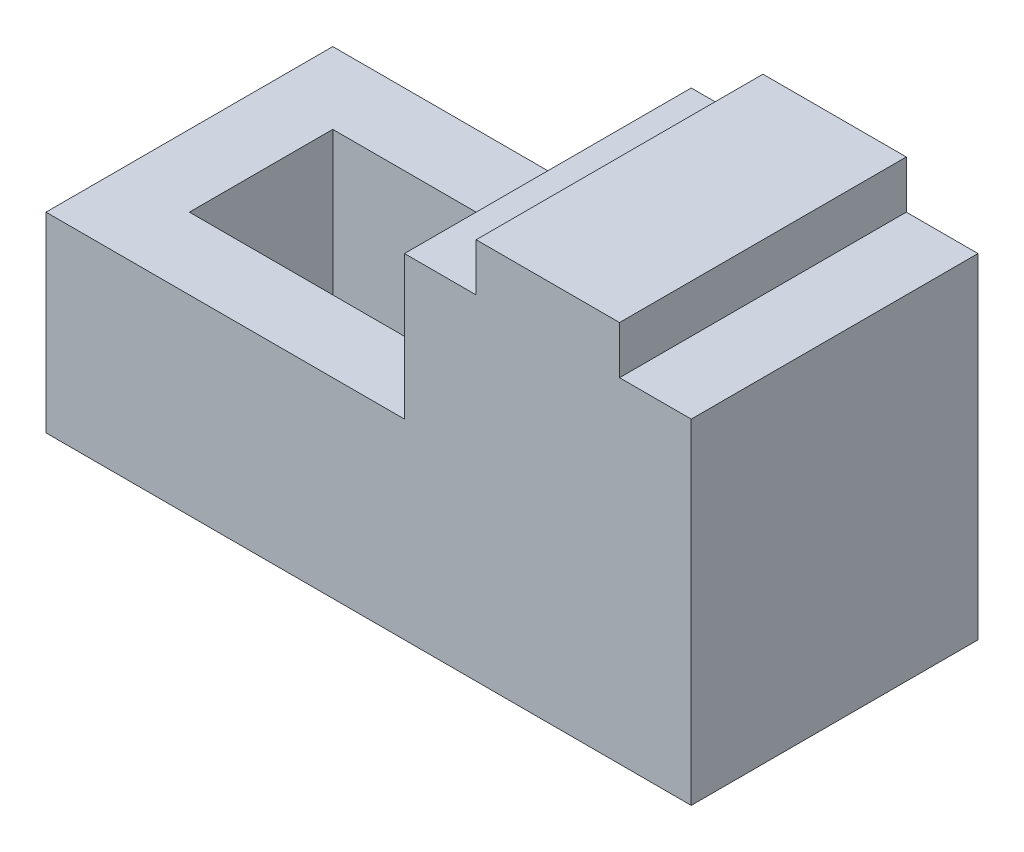
ISO-10303-21;
HEADER;
FILE_DESCRIPTION(('STEP AP214'),'2;1');
FILE_NAME('part.step','',(''),(''),'','','');
FILE_SCHEMA(('AUTOMOTIVE_DESIGN { 1 0 10303 214 1 1 1 1 }'));
ENDSEC;
DATA;
#1=APPLICATION_CONTEXT('core data for automotive mechanical design processes');
#2=APPLICATION_PROTOCOL_DEFINITION('international standard','automotive_design',2000,#1);
#3=PRODUCT_CONTEXT('',#1,'mechanical');
#4=PRODUCT('Part','Part','',(#3));
#5=PRODUCT_RELATED_PRODUCT_CATEGORY('part','',(#4));
#6=PRODUCT_DEFINITION_FORMATION('','',#4);
#7=PRODUCT_DEFINITION_CONTEXT('part definition',#1,'design');
#8=PRODUCT_DEFINITION('design','',#6,#7);
#9=PRODUCT_DEFINITION_SHAPE('','',#8);
#10=(LENGTH_UNIT() NAMED_UNIT(*) SI_UNIT(.MILLI.,.METRE.));
#11=(NAMED_UNIT(*) PLANE_ANGLE_UNIT() SI_UNIT($,.RADIAN.));
#12=(NAMED_UNIT(*) SI_UNIT($,.STERADIAN.) SOLID_ANGLE_UNIT());
#13=UNCERTAINTY_MEASURE_WITH_UNIT(LENGTH_MEASURE(1.E-05),#10,'distance_accuracy_value','');
#14=(GEOMETRIC_REPRESENTATION_CONTEXT(3) GLOBAL_UNCERTAINTY_ASSIGNED_CONTEXT((#13)) GLOBAL_UNIT_ASSIGNED_CONTEXT((#10,
#11,#12)) REPRESENTATION_CONTEXT('',''));
#15=CARTESIAN_POINT('',(0.,0.,0.));
#16=DIRECTION('',(0.,0.,1.));
#17=DIRECTION('',(1.,0.,0.));
#18=AXIS2_PLACEMENT_3D('',#15,#16,#17);
#19=CARTESIAN_POINT('',(60.,32.,48.));
#20=DIRECTION('',(0.,-1.,0.));
#21=DIRECTION('',(1.,0.,0.));
#22=AXIS2_PLACEMENT_3D('',#19,#20,#21);
#23=PLANE('',#22);
#24=DIRECTION('',(0.,0.,-1.));
#25=VECTOR('',#24,1.);
#26=CARTESIAN_POINT('',(60.,32.,48.));
#27=LINE('',#26,#25);
#28=CARTESIAN_POINT('',(60.,32.,48.));
#29=VERTEX_POINT('',#28);
#30=CARTESIAN_POINT('',(60.,32.,36.));
#31=VERTEX_POINT('',#30);
#32=EDGE_CURVE('E197',#29,#31,#27,.T.);
#33=ORIENTED_EDGE('',*,*,#32,.T.);
#34=DIRECTION('',(1.,0.,0.));
#35=VECTOR('',#34,1.);
#36=CARTESIAN_POINT('',(12.,32.,36.));
#37=LINE('',#36,#35);
#38=CARTESIAN_POINT('',(12.,32.,36.));
#39=VERTEX_POINT('',#38);
#40=EDGE_CURVE('E55',#39,#31,#37,.T.);
#41=ORIENTED_EDGE('',*,*,#40,.F.);
#42=DIRECTION('',(0.,0.,1.));
#43=VECTOR('',#42,1.);
#44=CARTESIAN_POINT('',(12.,32.,12.));
#45=LINE('',#44,#43);
#46=CARTESIAN_POINT('',(12.,32.,12.));
#47=VERTEX_POINT('',#46);
#48=EDGE_CURVE('E277',#47,#39,#45,.T.);
#49=ORIENTED_EDGE('',*,*,#48,.F.);
#50=DIRECTION('',(-1.,0.,0.));
#51=VECTOR('',#50,1.);
#52=CARTESIAN_POINT('',(60.,32.,12.));
#53=LINE('',#52,#51);
#54=CARTESIAN_POINT('',(60.,32.,12.));
#55=VERTEX_POINT('',#54);
#56=EDGE_CURVE('E281',#55,#47,#53,.T.);
#57=ORIENTED_EDGE('',*,*,#56,.F.);
#58=CARTESIAN_POINT('',(60.,32.,0.));
#59=VERTEX_POINT('',#58);
#60=EDGE_CURVE('E104',#55,#59,#27,.T.);
#61=ORIENTED_EDGE('',*,*,#60,.T.);
#62=DIRECTION('',(-1.,0.,0.));
#63=VECTOR('',#62,1.);
#64=CARTESIAN_POINT('',(60.,32.,0.));
#65=LINE('',#64,#63);
#66=CARTESIAN_POINT('',(0.,32.,0.));
#67=VERTEX_POINT('',#66);
#68=EDGE_CURVE('E166',#59,#67,#65,.T.);
#69=ORIENTED_EDGE('',*,*,#68,.T.);
#70=DIRECTION('',(0.,0.,-1.));
#71=VECTOR('',#70,1.);
#72=CARTESIAN_POINT('',(0.,32.,48.));
#73=LINE('',#72,#71);
#74=CARTESIAN_POINT('',(0.,32.,48.));
#75=VERTEX_POINT('',#74);
#76=EDGE_CURVE('E11',#75,#67,#73,.T.);
#77=ORIENTED_EDGE('',*,*,#76,.F.);
#78=DIRECTION('',(-1.,0.,0.));
#79=VECTOR('',#78,1.);
#80=CARTESIAN_POINT('',(60.,32.,48.));
#81=LINE('',#80,#79);
#82=EDGE_CURVE('E196',#29,#75,#81,.T.);
#83=ORIENTED_EDGE('',*,*,#82,.F.);
#84=EDGE_LOOP('',(#33,#41,#49,#57,#61,#69,#77,#83));
#85=FACE_BOUND('',#84,.T.);
#86=ADVANCED_FACE('F40',(#85),#23,.F.);
#87=CARTESIAN_POINT('',(0.,32.,48.));
#88=DIRECTION('',(1.,0.,0.));
#89=DIRECTION('',(0.,1.,0.));
#90=AXIS2_PLACEMENT_3D('',#87,#88,#89);
#91=PLANE('',#90);
#92=DIRECTION('',(0.,-1.,0.));
#93=VECTOR('',#92,1.);
#94=CARTESIAN_POINT('',(0.,32.,0.));
#95=LINE('',#94,#93);
#96=CARTESIAN_POINT('',(0.,0.,0.));
#97=VERTEX_POINT('',#96);
#98=EDGE_CURVE('E169',#67,#97,#95,.T.);
#99=ORIENTED_EDGE('',*,*,#98,.T.);
#100=DIRECTION('',(0.,0.,-1.));
#101=VECTOR('',#100,1.);
#102=CARTESIAN_POINT('',(0.,0.,48.));
#103=LINE('',#102,#101);
#104=CARTESIAN_POINT('',(0.,0.,48.));
#105=VERTEX_POINT('',#104);
#106=EDGE_CURVE('E48',#105,#97,#103,.T.);
#107=ORIENTED_EDGE('',*,*,#106,.F.);
#108=DIRECTION('',(0.,-1.,0.));
#109=VECTOR('',#108,1.);
#110=CARTESIAN_POINT('',(0.,32.,48.));
#111=LINE('',#110,#109);
#112=EDGE_CURVE('E112',#75,#105,#111,.T.);
#113=ORIENTED_EDGE('',*,*,#112,.F.);
#114=ORIENTED_EDGE('',*,*,#76,.T.);
#115=EDGE_LOOP('',(#99,#107,#113,#114));
#116=FACE_BOUND('',#115,.T.);
#117=ADVANCED_FACE('F326',(#116),#91,.F.);
#118=CARTESIAN_POINT('',(0.,0.,48.));
#119=DIRECTION('',(0.,1.,0.));
#120=DIRECTION('',(0.,0.,1.));
#121=AXIS2_PLACEMENT_3D('',#118,#119,#120);
#122=PLANE('',#121);
#123=DIRECTION('',(1.,0.,0.));
#124=VECTOR('',#123,1.);
#125=CARTESIAN_POINT('',(0.,0.,0.));
#126=LINE('',#125,#124);
#127=CARTESIAN_POINT('',(108.,0.,0.));
#128=VERTEX_POINT('',#127);
#129=EDGE_CURVE('E173',#97,#128,#126,.T.);
#130=ORIENTED_EDGE('',*,*,#129,.T.);
#131=DIRECTION('',(0.,0.,-1.));
#132=VECTOR('',#131,1.);
#133=CARTESIAN_POINT('',(108.,0.,48.));
#134=LINE('',#133,#132);
#135=CARTESIAN_POINT('',(108.,0.,48.));
#136=VERTEX_POINT('',#135);
#137=EDGE_CURVE('E217',#136,#128,#134,.T.);
#138=ORIENTED_EDGE('',*,*,#137,.F.);
#139=DIRECTION('',(1.,0.,0.));
#140=VECTOR('',#139,1.);
#141=CARTESIAN_POINT('',(0.,0.,48.));
#142=LINE('',#141,#140);
#143=EDGE_CURVE('E227',#105,#136,#142,.T.);
#144=ORIENTED_EDGE('',*,*,#143,.F.);
#145=ORIENTED_EDGE('',*,*,#106,.T.);
#146=EDGE_LOOP('',(#130,#138,#144,#145));
#147=FACE_BOUND('',#146,.T.);
#148=ADVANCED_FACE('F225',(#147),#122,.F.);
#149=CARTESIAN_POINT('',(108.,0.,48.));
#150=DIRECTION('',(-1.,0.,0.));
#151=DIRECTION('',(0.,0.,1.));
#152=AXIS2_PLACEMENT_3D('',#149,#150,#151);
#153=PLANE('',#152);
#154=DIRECTION('',(0.,1.,0.));
#155=VECTOR('',#154,1.);
#156=CARTESIAN_POINT('',(108.,0.,0.));
#157=LINE('',#156,#155);
#158=CARTESIAN_POINT('',(108.,56.,0.));
#159=VERTEX_POINT('',#158);
#160=EDGE_CURVE('E176',#128,#159,#157,.T.);
#161=ORIENTED_EDGE('',*,*,#160,.T.);
#162=DIRECTION('',(0.,0.,-1.));
#163=VECTOR('',#162,1.);
#164=CARTESIAN_POINT('',(108.,56.,48.));
#165=LINE('',#164,#163);
#166=CARTESIAN_POINT('',(108.,56.,48.));
#167=VERTEX_POINT('',#166);
#168=EDGE_CURVE('E213',#167,#159,#165,.T.);
#169=ORIENTED_EDGE('',*,*,#168,.F.);
#170=DIRECTION('',(0.,1.,0.));
#171=VECTOR('',#170,1.);
#172=CARTESIAN_POINT('',(108.,0.,48.));
#173=LINE('',#172,#171);
#174=EDGE_CURVE('E246',#136,#167,#173,.T.);
#175=ORIENTED_EDGE('',*,*,#174,.F.);
#176=ORIENTED_EDGE('',*,*,#137,.T.);
#177=EDGE_LOOP('',(#161,#169,#175,#176));
#178=FACE_BOUND('',#177,.T.);
#179=ADVANCED_FACE('F236',(#178),#153,.F.);
#180=CARTESIAN_POINT('',(108.,56.,48.));
#181=DIRECTION('',(0.,-1.,0.));
#182=DIRECTION('',(1.,0.,0.));
#183=AXIS2_PLACEMENT_3D('',#180,#181,#182);
#184=PLANE('',#183);
#185=DIRECTION('',(-1.,0.,0.));
#186=VECTOR('',#185,1.);
#187=CARTESIAN_POINT('',(108.,56.,0.));
#188=LINE('',#187,#186);
#189=CARTESIAN_POINT('',(96.,56.,0.));
#190=VERTEX_POINT('',#189);
#191=EDGE_CURVE('E179',#159,#190,#188,.T.);
#192=ORIENTED_EDGE('',*,*,#191,.T.);
#193=DIRECTION('',(0.,0.,-1.));
#194=VECTOR('',#193,1.);
#195=CARTESIAN_POINT('',(96.,56.,48.));
#196=LINE('',#195,#194);
#197=CARTESIAN_POINT('',(96.,56.,48.));
#198=VERTEX_POINT('',#197);
#199=EDGE_CURVE('E209',#198,#190,#196,.T.);
#200=ORIENTED_EDGE('',*,*,#199,.F.);
#201=DIRECTION('',(-1.,0.,0.));
#202=VECTOR('',#201,1.);
#203=CARTESIAN_POINT('',(108.,56.,48.));
#204=LINE('',#203,#202);
#205=EDGE_CURVE('E242',#167,#198,#204,.T.);
#206=ORIENTED_EDGE('',*,*,#205,.F.);
#207=ORIENTED_EDGE('',*,*,#168,.T.);
#208=EDGE_LOOP('',(#192,#200,#206,#207));
#209=FACE_BOUND('',#208,.T.);
#210=ADVANCED_FACE('F240',(#209),#184,.F.);
#211=CARTESIAN_POINT('',(96.,56.,48.));
#212=DIRECTION('',(-1.,0.,0.));
#213=DIRECTION('',(0.,0.,1.));
#214=AXIS2_PLACEMENT_3D('',#211,#212,#213);
#215=PLANE('',#214);
#216=DIRECTION('',(0.,1.,0.));
#217=VECTOR('',#216,1.);
#218=CARTESIAN_POINT('',(96.,56.,0.));
#219=LINE('',#218,#217);
#220=CARTESIAN_POINT('',(96.,64.,0.));
#221=VERTEX_POINT('',#220);
#222=EDGE_CURVE('E182',#190,#221,#219,.T.);
#223=ORIENTED_EDGE('',*,*,#222,.T.);
#224=DIRECTION('',(0.,0.,-1.));
#225=VECTOR('',#224,1.);
#226=CARTESIAN_POINT('',(96.,64.,48.));
#227=LINE('',#226,#225);
#228=CARTESIAN_POINT('',(96.,64.,48.));
#229=VERTEX_POINT('',#228);
#230=EDGE_CURVE('E205',#229,#221,#227,.T.);
#231=ORIENTED_EDGE('',*,*,#230,.F.);
#232=DIRECTION('',(0.,1.,0.));
#233=VECTOR('',#232,1.);
#234=CARTESIAN_POINT('',(96.,56.,48.));
#235=LINE('',#234,#233);
#236=EDGE_CURVE('E245',#198,#229,#235,.T.);
#237=ORIENTED_EDGE('',*,*,#236,.F.);
#238=ORIENTED_EDGE('',*,*,#199,.T.);
#239=EDGE_LOOP('',(#223,#231,#237,#238));
#240=FACE_BOUND('',#239,.T.);
#241=ADVANCED_FACE('F338',(#240),#215,.F.);
#242=CARTESIAN_POINT('',(96.,64.,48.));
#243=DIRECTION('',(0.,-1.,0.));
#244=DIRECTION('',(0.,0.,-1.));
#245=AXIS2_PLACEMENT_3D('',#242,#243,#244);
#246=PLANE('',#245);
#247=DIRECTION('',(-1.,0.,0.));
#248=VECTOR('',#247,1.);
#249=CARTESIAN_POINT('',(96.,64.,0.));
#250=LINE('',#249,#248);
#251=CARTESIAN_POINT('',(72.,64.,0.));
#252=VERTEX_POINT('',#251);
#253=EDGE_CURVE('E185',#221,#252,#250,.T.);
#254=ORIENTED_EDGE('',*,*,#253,.T.);
#255=DIRECTION('',(0.,0.,-1.));
#256=VECTOR('',#255,1.);
#257=CARTESIAN_POINT('',(72.,64.,48.));
#258=LINE('',#257,#256);
#259=CARTESIAN_POINT('',(72.,64.,48.));
#260=VERTEX_POINT('',#259);
#261=EDGE_CURVE('E155',#260,#252,#258,.T.);
#262=ORIENTED_EDGE('',*,*,#261,.F.);
#263=DIRECTION('',(-1.,0.,0.));
#264=VECTOR('',#263,1.);
#265=CARTESIAN_POINT('',(96.,64.,48.));
#266=LINE('',#265,#264);
#267=EDGE_CURVE('E141',#229,#260,#266,.T.);
#268=ORIENTED_EDGE('',*,*,#267,.F.);
#269=ORIENTED_EDGE('',*,*,#230,.T.);
#270=EDGE_LOOP('',(#254,#262,#268,#269));
#271=FACE_BOUND('',#270,.T.);
#272=ADVANCED_FACE('F341',(#271),#246,.F.);
#273=CARTESIAN_POINT('',(72.,64.,48.));
#274=DIRECTION('',(1.,0.,0.));
#275=DIRECTION('',(0.,1.,0.));
#276=AXIS2_PLACEMENT_3D('',#273,#274,#275);
#277=PLANE('',#276);
#278=DIRECTION('',(0.,-1.,0.));
#279=VECTOR('',#278,1.);
#280=CARTESIAN_POINT('',(72.,64.,0.));
#281=LINE('',#280,#279);
#282=CARTESIAN_POINT('',(72.,56.,0.));
#283=VERTEX_POINT('',#282);
#284=EDGE_CURVE('E151',#252,#283,#281,.T.);
#285=ORIENTED_EDGE('',*,*,#284,.T.);
#286=DIRECTION('',(0.,0.,-1.));
#287=VECTOR('',#286,1.);
#288=CARTESIAN_POINT('',(72.,56.,48.));
#289=LINE('',#288,#287);
#290=CARTESIAN_POINT('',(72.,56.,48.));
#291=VERTEX_POINT('',#290);
#292=EDGE_CURVE('E148',#291,#283,#289,.T.);
#293=ORIENTED_EDGE('',*,*,#292,.F.);
#294=DIRECTION('',(0.,-1.,0.));
#295=VECTOR('',#294,1.);
#296=CARTESIAN_POINT('',(72.,64.,48.));
#297=LINE('',#296,#295);
#298=EDGE_CURVE('E134',#260,#291,#297,.T.);
#299=ORIENTED_EDGE('',*,*,#298,.F.);
#300=ORIENTED_EDGE('',*,*,#261,.T.);
#301=EDGE_LOOP('',(#285,#293,#299,#300));
#302=FACE_BOUND('',#301,.T.);
#303=ADVANCED_FACE('F149',(#302),#277,.F.);
#304=CARTESIAN_POINT('',(72.,56.,48.));
#305=DIRECTION('',(0.,-1.,0.));
#306=DIRECTION('',(1.,0.,0.));
#307=AXIS2_PLACEMENT_3D('',#304,#305,#306);
#308=PLANE('',#307);
#309=DIRECTION('',(-1.,0.,0.));
#310=VECTOR('',#309,1.);
#311=CARTESIAN_POINT('',(72.,56.,0.));
#312=LINE('',#311,#310);
#313=CARTESIAN_POINT('',(60.,56.,0.));
#314=VERTEX_POINT('',#313);
#315=EDGE_CURVE('E190',#283,#314,#312,.T.);
#316=ORIENTED_EDGE('',*,*,#315,.T.);
#317=DIRECTION('',(0.,0.,-1.));
#318=VECTOR('',#317,1.);
#319=CARTESIAN_POINT('',(60.,56.,48.));
#320=LINE('',#319,#318);
#321=CARTESIAN_POINT('',(60.,56.,48.));
#322=VERTEX_POINT('',#321);
#323=EDGE_CURVE('E156',#322,#314,#320,.T.);
#324=ORIENTED_EDGE('',*,*,#323,.F.);
#325=DIRECTION('',(-1.,0.,0.));
#326=VECTOR('',#325,1.);
#327=CARTESIAN_POINT('',(72.,56.,48.));
#328=LINE('',#327,#326);
#329=EDGE_CURVE('E138',#291,#322,#328,.T.);
#330=ORIENTED_EDGE('',*,*,#329,.F.);
#331=ORIENTED_EDGE('',*,*,#292,.T.);
#332=EDGE_LOOP('',(#316,#324,#330,#331));
#333=FACE_BOUND('',#332,.T.);
#334=ADVANCED_FACE('F158',(#333),#308,.F.);
#335=CARTESIAN_POINT('',(60.,56.,48.));
#336=DIRECTION('',(1.,0.,0.));
#337=DIRECTION('',(0.,0.,-1.));
#338=AXIS2_PLACEMENT_3D('',#335,#336,#337);
#339=PLANE('',#338);
#340=DIRECTION('',(0.,-1.,0.));
#341=VECTOR('',#340,1.);
#342=CARTESIAN_POINT('',(60.,56.,0.));
#343=LINE('',#342,#341);
#344=EDGE_CURVE('E193',#314,#59,#343,.T.);
#345=ORIENTED_EDGE('',*,*,#344,.T.);
#346=ORIENTED_EDGE('',*,*,#60,.F.);
#347=DIRECTION('',(0.,1.,0.));
#348=VECTOR('',#347,1.);
#349=CARTESIAN_POINT('',(60.,8.00000000000001,12.));
#350=LINE('',#349,#348);
#351=CARTESIAN_POINT('',(60.,8.00000000000001,12.));
#352=VERTEX_POINT('',#351);
#353=EDGE_CURVE('E260',#352,#55,#350,.T.);
#354=ORIENTED_EDGE('',*,*,#353,.F.);
#355=DIRECTION('',(0.,0.,-1.));
#356=VECTOR('',#355,1.);
#357=CARTESIAN_POINT('',(60.,8.00000000000001,36.));
#358=LINE('',#357,#356);
#359=CARTESIAN_POINT('',(60.,8.00000000000001,36.));
#360=VERTEX_POINT('',#359);
#361=EDGE_CURVE('E276',#360,#352,#358,.T.);
#362=ORIENTED_EDGE('',*,*,#361,.F.);
#363=DIRECTION('',(0.,1.,0.));
#364=VECTOR('',#363,1.);
#365=CARTESIAN_POINT('',(60.,8.00000000000001,36.));
#366=LINE('',#365,#364);
#367=EDGE_CURVE('E170',#360,#31,#366,.T.);
#368=ORIENTED_EDGE('',*,*,#367,.T.);
#369=ORIENTED_EDGE('',*,*,#32,.F.);
#370=DIRECTION('',(0.,-1.,0.));
#371=VECTOR('',#370,1.);
#372=CARTESIAN_POINT('',(60.,56.,48.));
#373=LINE('',#372,#371);
#374=EDGE_CURVE('E64',#322,#29,#373,.T.);
#375=ORIENTED_EDGE('',*,*,#374,.F.);
#376=ORIENTED_EDGE('',*,*,#323,.T.);
#377=EDGE_LOOP('',(#345,#346,#354,#362,#368,#369,#375,#376));
#378=FACE_BOUND('',#377,.T.);
#379=ADVANCED_FACE('F308',(#378),#339,.F.);
#380=CARTESIAN_POINT('',(0.,0.,48.));
#381=DIRECTION('',(0.,0.,1.));
#382=DIRECTION('',(1.,0.,0.));
#383=AXIS2_PLACEMENT_3D('',#380,#381,#382);
#384=PLANE('',#383);
#385=ORIENTED_EDGE('',*,*,#82,.T.);
#386=ORIENTED_EDGE('',*,*,#112,.T.);
#387=ORIENTED_EDGE('',*,*,#143,.T.);
#388=ORIENTED_EDGE('',*,*,#174,.T.);
#389=ORIENTED_EDGE('',*,*,#205,.T.);
#390=ORIENTED_EDGE('',*,*,#236,.T.);
#391=ORIENTED_EDGE('',*,*,#267,.T.);
#392=ORIENTED_EDGE('',*,*,#298,.T.);
#393=ORIENTED_EDGE('',*,*,#329,.T.);
#394=ORIENTED_EDGE('',*,*,#374,.T.);
#395=EDGE_LOOP('',(#385,#386,#387,#388,#389,#390,#391,#392,#393,#394));
#396=FACE_BOUND('',#395,.T.);
#397=ADVANCED_FACE('F136',(#396),#384,.T.);
#398=CARTESIAN_POINT('',(0.,0.,0.));
#399=DIRECTION('',(0.,0.,1.));
#400=DIRECTION('',(1.,0.,0.));
#401=AXIS2_PLACEMENT_3D('',#398,#399,#400);
#402=PLANE('',#401);
#403=ORIENTED_EDGE('',*,*,#68,.F.);
#404=ORIENTED_EDGE('',*,*,#344,.F.);
#405=ORIENTED_EDGE('',*,*,#315,.F.);
#406=ORIENTED_EDGE('',*,*,#284,.F.);
#407=ORIENTED_EDGE('',*,*,#253,.F.);
#408=ORIENTED_EDGE('',*,*,#222,.F.);
#409=ORIENTED_EDGE('',*,*,#191,.F.);
#410=ORIENTED_EDGE('',*,*,#160,.F.);
#411=ORIENTED_EDGE('',*,*,#129,.F.);
#412=ORIENTED_EDGE('',*,*,#98,.F.);
#413=EDGE_LOOP('',(#403,#404,#405,#406,#407,#408,#409,#410,#411,#412));
#414=FACE_BOUND('',#413,.T.);
#415=ADVANCED_FACE('F231',(#414),#402,.F.);
#416=CARTESIAN_POINT('',(12.,8.,36.));
#417=DIRECTION('',(0.,0.,1.));
#418=DIRECTION('',(1.,0.,0.));
#419=AXIS2_PLACEMENT_3D('',#416,#417,#418);
#420=PLANE('',#419);
#421=ORIENTED_EDGE('',*,*,#40,.T.);
#422=ORIENTED_EDGE('',*,*,#367,.F.);
#423=DIRECTION('',(1.,0.,0.));
#424=VECTOR('',#423,1.);
#425=CARTESIAN_POINT('',(12.,8.,36.));
#426=LINE('',#425,#424);
#427=CARTESIAN_POINT('',(12.,8.,36.));
#428=VERTEX_POINT('',#427);
#429=EDGE_CURVE('E265',#428,#360,#426,.T.);
#430=ORIENTED_EDGE('',*,*,#429,.F.);
#431=DIRECTION('',(0.,1.,0.));
#432=VECTOR('',#431,1.);
#433=CARTESIAN_POINT('',(12.,8.,36.));
#434=LINE('',#433,#432);
#435=EDGE_CURVE('E269',#428,#39,#434,.T.);
#436=ORIENTED_EDGE('',*,*,#435,.T.);
#437=EDGE_LOOP('',(#421,#422,#430,#436));
#438=FACE_BOUND('',#437,.T.);
#439=ADVANCED_FACE('F320',(#438),#420,.F.);
#440=CARTESIAN_POINT('',(12.,8.,12.));
#441=DIRECTION('',(-1.,0.,0.));
#442=DIRECTION('',(0.,-1.,0.));
#443=AXIS2_PLACEMENT_3D('',#440,#441,#442);
#444=PLANE('',#443);
#445=ORIENTED_EDGE('',*,*,#48,.T.);
#446=ORIENTED_EDGE('',*,*,#435,.F.);
#447=DIRECTION('',(0.,0.,1.));
#448=VECTOR('',#447,1.);
#449=CARTESIAN_POINT('',(12.,8.,12.));
#450=LINE('',#449,#448);
#451=CARTESIAN_POINT('',(12.,8.,12.));
#452=VERTEX_POINT('',#451);
#453=EDGE_CURVE('E288',#452,#428,#450,.T.);
#454=ORIENTED_EDGE('',*,*,#453,.F.);
#455=DIRECTION('',(0.,1.,0.));
#456=VECTOR('',#455,1.);
#457=CARTESIAN_POINT('',(12.,8.,12.));
#458=LINE('',#457,#456);
#459=EDGE_CURVE('E264',#452,#47,#458,.T.);
#460=ORIENTED_EDGE('',*,*,#459,.T.);
#461=EDGE_LOOP('',(#445,#446,#454,#460));
#462=FACE_BOUND('',#461,.T.);
#463=ADVANCED_FACE('F322',(#462),#444,.F.);
#464=CARTESIAN_POINT('',(60.,8.00000000000001,12.));
#465=DIRECTION('',(0.,0.,-1.));
#466=DIRECTION('',(-1.,0.,0.));
#467=AXIS2_PLACEMENT_3D('',#464,#465,#466);
#468=PLANE('',#467);
#469=ORIENTED_EDGE('',*,*,#56,.T.);
#470=ORIENTED_EDGE('',*,*,#459,.F.);
#471=DIRECTION('',(-1.,0.,0.));
#472=VECTOR('',#471,1.);
#473=CARTESIAN_POINT('',(60.,8.00000000000001,12.));
#474=LINE('',#473,#472);
#475=EDGE_CURVE('E292',#352,#452,#474,.T.);
#476=ORIENTED_EDGE('',*,*,#475,.F.);
#477=ORIENTED_EDGE('',*,*,#353,.T.);
#478=EDGE_LOOP('',(#469,#470,#476,#477));
#479=FACE_BOUND('',#478,.T.);
#480=ADVANCED_FACE('F356',(#479),#468,.F.);
#481=CARTESIAN_POINT('',(0.,8.,0.));
#482=DIRECTION('',(0.,1.,0.));
#483=DIRECTION('',(-1.,0.,0.));
#484=AXIS2_PLACEMENT_3D('',#481,#482,#483);
#485=PLANE('',#484);
#486=ORIENTED_EDGE('',*,*,#361,.T.);
#487=ORIENTED_EDGE('',*,*,#475,.T.);
#488=ORIENTED_EDGE('',*,*,#453,.T.);
#489=ORIENTED_EDGE('',*,*,#429,.T.);
#490=EDGE_LOOP('',(#486,#487,#488,#489));
#491=FACE_BOUND('',#490,.T.);
#492=ADVANCED_FACE('F301',(#491),#485,.T.);
#493=CLOSED_SHELL('',(#86,#117,#148,#179,#210,#241,#272,#303,#334,#379,#397,#415,#439,#463,#480,#492));
#494=MANIFOLD_SOLID_BREP('B2',#493);
#495=ADVANCED_BREP_SHAPE_REPRESENTATION('',(#18,#494),#14);
#496=SHAPE_DEFINITION_REPRESENTATION(#9,#495);
ENDSEC;
END-ISO-10303-21;
